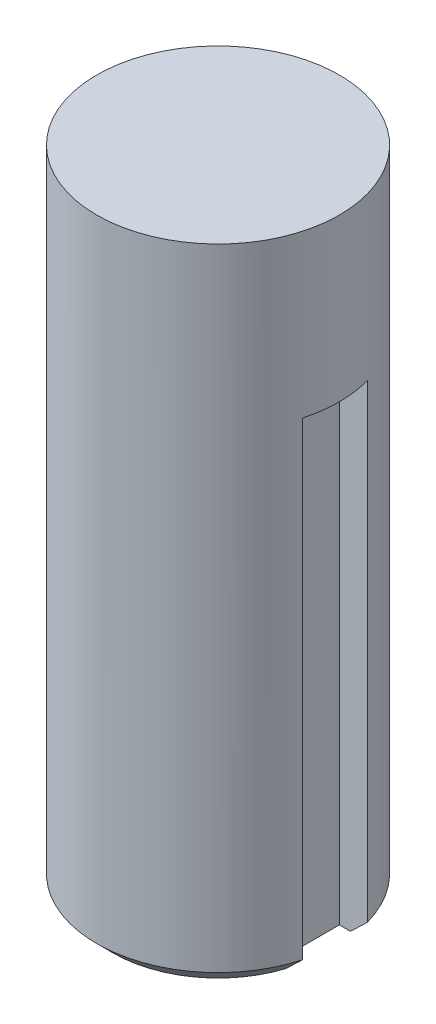
ISO-10303-21;
HEADER;
FILE_DESCRIPTION(('STEP AP214'),'2;1');
FILE_NAME('part.step','',(''),(''),'','','');
FILE_SCHEMA(('AUTOMOTIVE_DESIGN { 1 0 10303 214 1 1 1 1 }'));
ENDSEC;
DATA;
#1=APPLICATION_CONTEXT('core data for automotive mechanical design processes');
#2=APPLICATION_PROTOCOL_DEFINITION('international standard','automotive_design',2000,#1);
#3=PRODUCT_CONTEXT('',#1,'mechanical');
#4=PRODUCT('Part','Part','',(#3));
#5=PRODUCT_RELATED_PRODUCT_CATEGORY('part','',(#4));
#6=PRODUCT_DEFINITION_FORMATION('','',#4);
#7=PRODUCT_DEFINITION_CONTEXT('part definition',#1,'design');
#8=PRODUCT_DEFINITION('design','',#6,#7);
#9=PRODUCT_DEFINITION_SHAPE('','',#8);
#10=(LENGTH_UNIT() NAMED_UNIT(*) SI_UNIT(.MILLI.,.METRE.));
#11=(NAMED_UNIT(*) PLANE_ANGLE_UNIT() SI_UNIT($,.RADIAN.));
#12=(NAMED_UNIT(*) SI_UNIT($,.STERADIAN.) SOLID_ANGLE_UNIT());
#13=UNCERTAINTY_MEASURE_WITH_UNIT(LENGTH_MEASURE(1.E-05),#10,'distance_accuracy_value','');
#14=(GEOMETRIC_REPRESENTATION_CONTEXT(3) GLOBAL_UNCERTAINTY_ASSIGNED_CONTEXT((#13)) GLOBAL_UNIT_ASSIGNED_CONTEXT((#10,
#11,#12)) REPRESENTATION_CONTEXT('',''));
#15=CARTESIAN_POINT('',(0.,0.,0.));
#16=DIRECTION('',(0.,0.,1.));
#17=DIRECTION('',(1.,0.,0.));
#18=AXIS2_PLACEMENT_3D('',#15,#16,#17);
#19=CARTESIAN_POINT('',(14.,57.,0.));
#20=DIRECTION('',(0.,0.,1.));
#21=DIRECTION('',(1.,0.,0.));
#22=AXIS2_PLACEMENT_3D('',#19,#20,#21);
#23=CYLINDRICAL_SURFACE('',#22,3.);
#24=DIRECTION('',(0.,0.,1.));
#25=VECTOR('',#24,1.);
#26=CARTESIAN_POINT('',(11.,57.,0.));
#27=LINE('',#26,#25);
#28=CARTESIAN_POINT('',(11.,57.,-4.));
#29=VERTEX_POINT('',#28);
#30=CARTESIAN_POINT('',(11.,57.,4.));
#31=VERTEX_POINT('',#30);
#32=EDGE_CURVE('E126',#29,#31,#27,.T.);
#33=ORIENTED_EDGE('',*,*,#32,.F.);
#34=CARTESIAN_POINT('',(14.,57.,-4.));
#35=DIRECTION('',(0.,0.,-1.));
#36=DIRECTION('',(-1.,0.,0.));
#37=AXIS2_PLACEMENT_3D('',#34,#35,#36);
#38=CIRCLE('',#37,3.);
#39=CARTESIAN_POINT('',(14.,60.,-4.));
#40=VERTEX_POINT('',#39);
#41=EDGE_CURVE('E136',#40,#29,#38,.F.);
#42=ORIENTED_EDGE('',*,*,#41,.F.);
#43=DIRECTION('',(0.,0.,1.));
#44=VECTOR('',#43,1.);
#45=CARTESIAN_POINT('',(14.,60.,0.));
#46=LINE('',#45,#44);
#47=CARTESIAN_POINT('',(14.,60.,4.));
#48=VERTEX_POINT('',#47);
#49=EDGE_CURVE('E134',#48,#40,#46,.F.);
#50=ORIENTED_EDGE('',*,*,#49,.F.);
#51=CARTESIAN_POINT('',(14.,57.,4.));
#52=DIRECTION('',(0.,0.,-1.));
#53=DIRECTION('',(-1.,0.,0.));
#54=AXIS2_PLACEMENT_3D('',#51,#52,#53);
#55=CIRCLE('',#54,3.);
#56=EDGE_CURVE('E103',#31,#48,#55,.T.);
#57=ORIENTED_EDGE('',*,*,#56,.F.);
#58=EDGE_LOOP('',(#33,#42,#50,#57));
#59=FACE_BOUND('',#58,.T.);
#60=ADVANCED_FACE('F39',(#59),#23,.F.);
#61=CARTESIAN_POINT('',(0.,80.,0.));
#62=DIRECTION('',(0.,-1.,0.));
#63=DIRECTION('',(0.,0.,-1.));
#64=AXIS2_PLACEMENT_3D('',#61,#62,#63);
#65=CYLINDRICAL_SURFACE('',#64,15.);
#66=CARTESIAN_POINT('',(0.,80.,0.));
#67=DIRECTION('',(0.,1.,0.));
#68=DIRECTION('',(0.,0.,1.));
#69=AXIS2_PLACEMENT_3D('',#66,#67,#68);
#70=CIRCLE('',#69,15.);
#71=CARTESIAN_POINT('',(0.,80.,15.));
#72=VERTEX_POINT('',#71);
#73=EDGE_CURVE('E122',#72,#72,#70,.T.);
#74=ORIENTED_EDGE('',*,*,#73,.F.);
#75=EDGE_LOOP('',(#74));
#76=FACE_BOUND('',#75,.T.);
#77=DIRECTION('',(0.,-1.,0.));
#78=VECTOR('',#77,1.);
#79=CARTESIAN_POINT('',(14.456832294801,60.,-4.));
#80=LINE('',#79,#78);
#81=CARTESIAN_POINT('',(14.456832294801,60.,-4.));
#82=VERTEX_POINT('',#81);
#83=CARTESIAN_POINT('',(14.456832294801,2.,-4.));
#84=VERTEX_POINT('',#83);
#85=EDGE_CURVE('E123',#82,#84,#80,.T.);
#86=ORIENTED_EDGE('',*,*,#85,.T.);
#87=CARTESIAN_POINT('',(0.,2.,0.));
#88=DIRECTION('',(0.,1.,0.));
#89=DIRECTION('',(0.,0.,1.));
#90=AXIS2_PLACEMENT_3D('',#87,#88,#89);
#91=CIRCLE('',#90,15.);
#92=CARTESIAN_POINT('',(14.456832294801,2.,4.));
#93=VERTEX_POINT('',#92);
#94=EDGE_CURVE('E121',#84,#93,#91,.T.);
#95=ORIENTED_EDGE('',*,*,#94,.T.);
#96=DIRECTION('',(0.,-1.,0.));
#97=VECTOR('',#96,1.);
#98=CARTESIAN_POINT('',(14.456832294801,60.,4.));
#99=LINE('',#98,#97);
#100=CARTESIAN_POINT('',(14.456832294801,60.,4.));
#101=VERTEX_POINT('',#100);
#102=EDGE_CURVE('E101',#101,#93,#99,.T.);
#103=ORIENTED_EDGE('',*,*,#102,.F.);
#104=CARTESIAN_POINT('',(0.,60.,0.));
#105=DIRECTION('',(0.,1.,0.));
#106=DIRECTION('',(0.,0.,1.));
#107=AXIS2_PLACEMENT_3D('',#104,#105,#106);
#108=CIRCLE('',#107,15.);
#109=EDGE_CURVE('E107',#101,#82,#108,.T.);
#110=ORIENTED_EDGE('',*,*,#109,.T.);
#111=EDGE_LOOP('',(#86,#95,#103,#110));
#112=FACE_BOUND('',#111,.T.);
#113=ADVANCED_FACE('F119',(#76,#112),#65,.T.);
#114=CARTESIAN_POINT('',(0.,0.,0.));
#115=DIRECTION('',(0.,1.,0.));
#116=DIRECTION('',(0.,0.,1.));
#117=AXIS2_PLACEMENT_3D('',#114,#115,#116);
#118=PLANE('',#117);
#119=DIRECTION('',(1.,0.,0.));
#120=VECTOR('',#119,1.);
#121=CARTESIAN_POINT('',(0.,0.,4.));
#122=LINE('',#121,#120);
#123=CARTESIAN_POINT('',(11.,0.,4.));
#124=VERTEX_POINT('',#123);
#125=CARTESIAN_POINT('',(12.369316876853,0.,4.));
#126=VERTEX_POINT('',#125);
#127=EDGE_CURVE('E177',#124,#126,#122,.T.);
#128=ORIENTED_EDGE('',*,*,#127,.T.);
#129=CARTESIAN_POINT('',(0.,0.,0.));
#130=DIRECTION('',(0.,1.,0.));
#131=DIRECTION('',(0.,0.,1.));
#132=AXIS2_PLACEMENT_3D('',#129,#130,#131);
#133=CIRCLE('',#132,13.);
#134=CARTESIAN_POINT('',(12.369316876853,0.,-4.));
#135=VERTEX_POINT('',#134);
#136=EDGE_CURVE('E54',#126,#135,#133,.F.);
#137=ORIENTED_EDGE('',*,*,#136,.T.);
#138=DIRECTION('',(1.,0.,0.));
#139=VECTOR('',#138,1.);
#140=CARTESIAN_POINT('',(0.,0.,-4.));
#141=LINE('',#140,#139);
#142=CARTESIAN_POINT('',(11.,0.,-4.));
#143=VERTEX_POINT('',#142);
#144=EDGE_CURVE('E175',#143,#135,#141,.T.);
#145=ORIENTED_EDGE('',*,*,#144,.F.);
#146=DIRECTION('',(0.,0.,1.));
#147=VECTOR('',#146,1.);
#148=CARTESIAN_POINT('',(11.,0.,0.));
#149=LINE('',#148,#147);
#150=EDGE_CURVE('E108',#143,#124,#149,.T.);
#151=ORIENTED_EDGE('',*,*,#150,.T.);
#152=EDGE_LOOP('',(#128,#137,#145,#151));
#153=FACE_BOUND('',#152,.T.);
#154=ADVANCED_FACE('F154',(#153),#118,.F.);
#155=CARTESIAN_POINT('',(0.,80.,0.));
#156=DIRECTION('',(0.,1.,0.));
#157=DIRECTION('',(0.,0.,1.));
#158=AXIS2_PLACEMENT_3D('',#155,#156,#157);
#159=PLANE('',#158);
#160=ORIENTED_EDGE('',*,*,#73,.T.);
#161=EDGE_LOOP('',(#160));
#162=FACE_BOUND('',#161,.T.);
#163=ADVANCED_FACE('F149',(#162),#159,.T.);
#164=CARTESIAN_POINT('',(0.,60.,4.));
#165=DIRECTION('',(0.,0.,-1.));
#166=DIRECTION('',(-1.,0.,0.));
#167=AXIS2_PLACEMENT_3D('',#164,#165,#166);
#168=PLANE('',#167);
#169=ORIENTED_EDGE('',*,*,#102,.T.);
#170=CARTESIAN_POINT('',(14.456832294801,2.,4.));
#171=CARTESIAN_POINT('',(14.2833673736341,1.83281762229359,4.));
#172=CARTESIAN_POINT('',(14.1097966672148,1.66574492959666,4.));
#173=CARTESIAN_POINT('',(13.7624180287548,1.33184724730148,4.));
#174=CARTESIAN_POINT('',(13.58861009732,1.16502225707267,4.));
#175=CARTESIAN_POINT('',(13.2407303813156,0.831647375555982,4.));
#176=CARTESIAN_POINT('',(13.0666585966125,0.665097484407292,4.));
#177=CARTESIAN_POINT('',(12.7182183007377,0.332307513310925,4.));
#178=CARTESIAN_POINT('',(12.5438497888099,0.166067434154968,4.));
#179=CARTESIAN_POINT('',(12.369316876853,0.,4.));
#180=B_SPLINE_CURVE_WITH_KNOTS('',3,(#170,#171,#172,#173,#174,#175,#176,#177,#178,#179),
.UNSPECIFIED.,.F.,.F.,(4,2,2,2,4),(0.,0.722744958615951,1.44548807419883,2.16823155533114,
2.89097688089564),.UNSPECIFIED.);
#181=EDGE_CURVE('E68',#93,#126,#180,.T.);
#182=ORIENTED_EDGE('',*,*,#181,.T.);
#183=ORIENTED_EDGE('',*,*,#127,.F.);
#184=DIRECTION('',(0.,-1.,0.));
#185=VECTOR('',#184,1.);
#186=CARTESIAN_POINT('',(11.,60.,4.));
#187=LINE('',#186,#185);
#188=EDGE_CURVE('E171',#31,#124,#187,.T.);
#189=ORIENTED_EDGE('',*,*,#188,.F.);
#190=ORIENTED_EDGE('',*,*,#56,.T.);
#191=DIRECTION('',(1.,0.,0.));
#192=VECTOR('',#191,1.);
#193=CARTESIAN_POINT('',(0.,60.,4.));
#194=LINE('',#193,#192);
#195=EDGE_CURVE('E97',#48,#101,#194,.T.);
#196=ORIENTED_EDGE('',*,*,#195,.T.);
#197=EDGE_LOOP('',(#169,#182,#183,#189,#190,#196));
#198=FACE_BOUND('',#197,.T.);
#199=ADVANCED_FACE('F99',(#198),#168,.T.);
#200=CARTESIAN_POINT('',(0.,60.,-4.));
#201=DIRECTION('',(0.,0.,-1.));
#202=DIRECTION('',(-1.,0.,0.));
#203=AXIS2_PLACEMENT_3D('',#200,#201,#202);
#204=PLANE('',#203);
#205=ORIENTED_EDGE('',*,*,#144,.T.);
#206=CARTESIAN_POINT('',(12.369316876853,0.,-4.));
#207=CARTESIAN_POINT('',(12.5438497888099,0.166067434154968,-4.));
#208=CARTESIAN_POINT('',(12.7182183007377,0.332307513310926,-4.));
#209=CARTESIAN_POINT('',(13.0666585966125,0.665097484407293,-4.));
#210=CARTESIAN_POINT('',(13.2407303813156,0.831647375555983,-4.));
#211=CARTESIAN_POINT('',(13.58861009732,1.16502225707267,-4.));
#212=CARTESIAN_POINT('',(13.7624180287548,1.33184724730148,-4.));
#213=CARTESIAN_POINT('',(14.1097966672148,1.66574492959666,-4.));
#214=CARTESIAN_POINT('',(14.2833673736341,1.83281762229359,-4.));
#215=CARTESIAN_POINT('',(14.456832294801,2.,-4.));
#216=B_SPLINE_CURVE_WITH_KNOTS('',3,(#206,#207,#208,#209,#210,#211,#212,#213,#214,#215),
.UNSPECIFIED.,.F.,.F.,(4,2,2,2,4),(0.,0.722745325564508,1.44548880669681,2.16823192227969,
2.89097688089564),.UNSPECIFIED.);
#217=EDGE_CURVE('E11',#135,#84,#216,.T.);
#218=ORIENTED_EDGE('',*,*,#217,.T.);
#219=ORIENTED_EDGE('',*,*,#85,.F.);
#220=DIRECTION('',(1.,0.,0.));
#221=VECTOR('',#220,1.);
#222=CARTESIAN_POINT('',(0.,60.,-4.));
#223=LINE('',#222,#221);
#224=EDGE_CURVE('E113',#40,#82,#223,.T.);
#225=ORIENTED_EDGE('',*,*,#224,.F.);
#226=ORIENTED_EDGE('',*,*,#41,.T.);
#227=DIRECTION('',(0.,-1.,0.));
#228=VECTOR('',#227,1.);
#229=CARTESIAN_POINT('',(11.,60.,-4.));
#230=LINE('',#229,#228);
#231=EDGE_CURVE('E128',#29,#143,#230,.T.);
#232=ORIENTED_EDGE('',*,*,#231,.T.);
#233=EDGE_LOOP('',(#205,#218,#219,#225,#226,#232));
#234=FACE_BOUND('',#233,.T.);
#235=ADVANCED_FACE('F148',(#234),#204,.F.);
#236=CARTESIAN_POINT('',(11.,60.,0.));
#237=DIRECTION('',(1.,0.,0.));
#238=DIRECTION('',(0.,0.,-1.));
#239=AXIS2_PLACEMENT_3D('',#236,#237,#238);
#240=PLANE('',#239);
#241=ORIENTED_EDGE('',*,*,#231,.F.);
#242=ORIENTED_EDGE('',*,*,#32,.T.);
#243=ORIENTED_EDGE('',*,*,#188,.T.);
#244=ORIENTED_EDGE('',*,*,#150,.F.);
#245=EDGE_LOOP('',(#241,#242,#243,#244));
#246=FACE_BOUND('',#245,.T.);
#247=ADVANCED_FACE('F168',(#246),#240,.T.);
#248=CARTESIAN_POINT('',(0.,60.,0.));
#249=DIRECTION('',(0.,1.,0.));
#250=DIRECTION('',(0.,0.,1.));
#251=AXIS2_PLACEMENT_3D('',#248,#249,#250);
#252=PLANE('',#251);
#253=ORIENTED_EDGE('',*,*,#195,.F.);
#254=ORIENTED_EDGE('',*,*,#49,.T.);
#255=ORIENTED_EDGE('',*,*,#224,.T.);
#256=ORIENTED_EDGE('',*,*,#109,.F.);
#257=EDGE_LOOP('',(#253,#254,#255,#256));
#258=FACE_BOUND('',#257,.T.);
#259=ADVANCED_FACE('F111',(#258),#252,.F.);
#260=CARTESIAN_POINT('',(0.,2.,0.));
#261=DIRECTION('',(0.,1.,0.));
#262=DIRECTION('',(0.,0.,1.));
#263=AXIS2_PLACEMENT_3D('',#260,#261,#262);
#264=CONICAL_SURFACE('',#263,15.,0.78539816339745);
#265=ORIENTED_EDGE('',*,*,#217,.F.);
#266=ORIENTED_EDGE('',*,*,#136,.F.);
#267=ORIENTED_EDGE('',*,*,#181,.F.);
#268=ORIENTED_EDGE('',*,*,#94,.F.);
#269=EDGE_LOOP('',(#265,#266,#267,#268));
#270=FACE_BOUND('',#269,.T.);
#271=ADVANCED_FACE('F42',(#270),#264,.T.);
#272=CLOSED_SHELL('',(#60,#113,#154,#163,#199,#235,#247,#259,#271));
#273=MANIFOLD_SOLID_BREP('B2',#272);
#274=ADVANCED_BREP_SHAPE_REPRESENTATION('',(#18,#273),#14);
#275=SHAPE_DEFINITION_REPRESENTATION(#9,#274);
ENDSEC;
END-ISO-10303-21;
